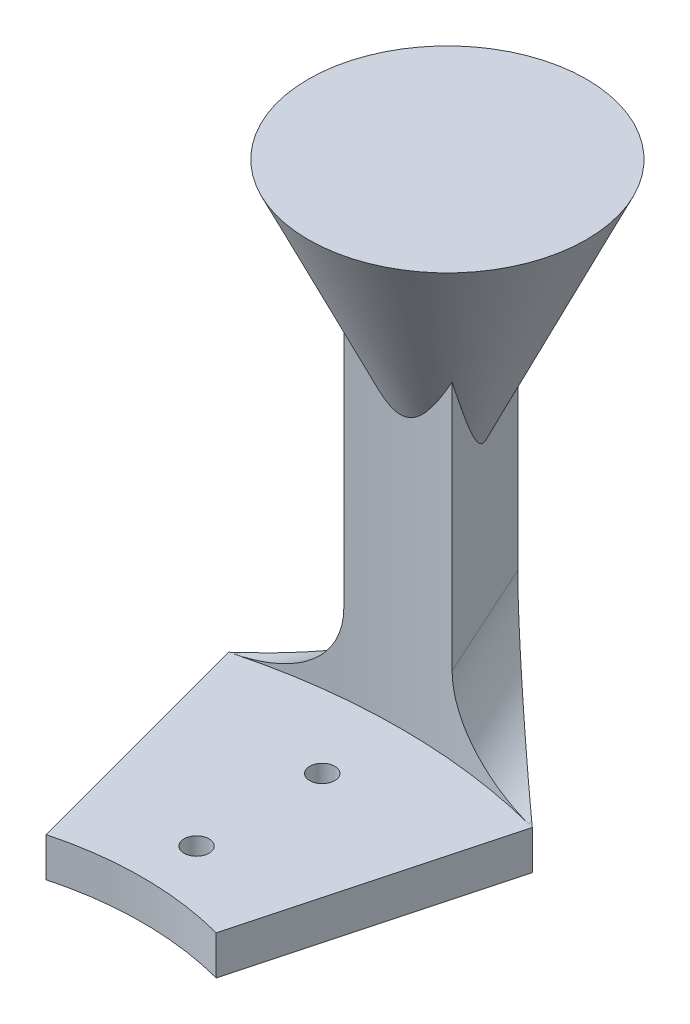
ISO-10303-21;
HEADER;
FILE_DESCRIPTION(('STEP AP214'),'2;1');
FILE_NAME('part.step','',(''),(''),'','','');
FILE_SCHEMA(('AUTOMOTIVE_DESIGN { 1 0 10303 214 1 1 1 1 }'));
ENDSEC;
DATA;
#1=APPLICATION_CONTEXT('core data for automotive mechanical design processes');
#2=APPLICATION_PROTOCOL_DEFINITION('international standard','automotive_design',2000,#1);
#3=PRODUCT_CONTEXT('',#1,'mechanical');
#4=PRODUCT('Part','Part','',(#3));
#5=PRODUCT_RELATED_PRODUCT_CATEGORY('part','',(#4));
#6=PRODUCT_DEFINITION_FORMATION('','',#4);
#7=PRODUCT_DEFINITION_CONTEXT('part definition',#1,'design');
#8=PRODUCT_DEFINITION('design','',#6,#7);
#9=PRODUCT_DEFINITION_SHAPE('','',#8);
#10=(LENGTH_UNIT() NAMED_UNIT(*) SI_UNIT(.MILLI.,.METRE.));
#11=(NAMED_UNIT(*) PLANE_ANGLE_UNIT() SI_UNIT($,.RADIAN.));
#12=(NAMED_UNIT(*) SI_UNIT($,.STERADIAN.) SOLID_ANGLE_UNIT());
#13=UNCERTAINTY_MEASURE_WITH_UNIT(LENGTH_MEASURE(1.E-05),#10,'distance_accuracy_value','');
#14=(GEOMETRIC_REPRESENTATION_CONTEXT(3) GLOBAL_UNCERTAINTY_ASSIGNED_CONTEXT((#13)) GLOBAL_UNIT_ASSIGNED_CONTEXT((#10,
#11,#12)) REPRESENTATION_CONTEXT('',''));
#15=CARTESIAN_POINT('',(0.,0.,0.));
#16=DIRECTION('',(0.,0.,1.));
#17=DIRECTION('',(1.,0.,0.));
#18=AXIS2_PLACEMENT_3D('',#15,#16,#17);
#19=CARTESIAN_POINT('',(0.,5.,0.));
#20=DIRECTION('',(0.,1.,0.));
#21=DIRECTION('',(0.,0.,1.));
#22=AXIS2_PLACEMENT_3D('',#19,#20,#21);
#23=PLANE('',#22);
#24=CARTESIAN_POINT('',(0.,5.,-48.92241394));
#25=DIRECTION('',(0.,1.,0.));
#26=DIRECTION('',(0.,0.,1.));
#27=AXIS2_PLACEMENT_3D('',#24,#25,#26);
#28=CIRCLE('',#27,1.6);
#29=CARTESIAN_POINT('',(0.,5.,-47.32241394));
#30=VERTEX_POINT('',#29);
#31=EDGE_CURVE('E257',#30,#30,#28,.T.);
#32=ORIENTED_EDGE('',*,*,#31,.F.);
#33=EDGE_LOOP('',(#32));
#34=FACE_BOUND('',#33,.T.);
#35=CARTESIAN_POINT('',(0.,5.,-65.));
#36=DIRECTION('',(0.,1.,0.));
#37=DIRECTION('',(0.,0.,1.));
#38=AXIS2_PLACEMENT_3D('',#35,#36,#37);
#39=CIRCLE('',#38,1.6);
#40=CARTESIAN_POINT('',(0.,5.,-63.4));
#41=VERTEX_POINT('',#40);
#42=EDGE_CURVE('E261',#41,#41,#39,.T.);
#43=ORIENTED_EDGE('',*,*,#42,.F.);
#44=EDGE_LOOP('',(#43));
#45=FACE_BOUND('',#44,.T.);
#46=CARTESIAN_POINT('',(0.,5.,0.));
#47=DIRECTION('',(0.,1.,0.));
#48=DIRECTION('',(0.,0.,1.));
#49=AXIS2_PLACEMENT_3D('',#46,#47,#48);
#50=CIRCLE('',#49,75.);
#51=CARTESIAN_POINT('',(18.842619407503,5.,-72.5944604902054));
#52=VERTEX_POINT('',#51);
#53=CARTESIAN_POINT('',(-18.842619407503,5.,-72.5944604902054));
#54=VERTEX_POINT('',#53);
#55=EDGE_CURVE('E148',#52,#54,#50,.T.);
#56=ORIENTED_EDGE('',*,*,#55,.T.);
#57=DIRECTION('',(0.411923166329655,0.,-0.91121858247127));
#58=VECTOR('',#57,1.);
#59=CARTESIAN_POINT('',(-9.11218582471269,5.,-94.1192316632966));
#60=LINE('',#59,#58);
#61=CARTESIAN_POINT('',(-18.563962791194,5.,-73.210879054793));
#62=VERTEX_POINT('',#61);
#63=EDGE_CURVE('E265',#54,#62,#60,.T.);
#64=ORIENTED_EDGE('',*,*,#63,.T.);
#65=DIRECTION('',(0.741671826170857,0.,-0.670762925529122));
#66=VECTOR('',#65,1.);
#67=CARTESIAN_POINT('',(-44.7737367514401,5.,-49.5069387962052));
#68=LINE('',#67,#66);
#69=CARTESIAN_POINT('',(-19.4114283826891,5.,-72.4444369716801));
#70=VERTEX_POINT('',#69);
#71=EDGE_CURVE('E274',#70,#62,#68,.T.);
#72=ORIENTED_EDGE('',*,*,#71,.F.);
#73=DIRECTION('',(-0.258819045102522,0.,-0.965925826289068));
#74=VECTOR('',#73,1.);
#75=CARTESIAN_POINT('',(0.,5.,0.));
#76=LINE('',#75,#74);
#77=CARTESIAN_POINT('',(-10.8703998943059,5.,-40.5688847041409));
#78=VERTEX_POINT('',#77);
#79=EDGE_CURVE('E278',#78,#70,#76,.T.);
#80=ORIENTED_EDGE('',*,*,#79,.F.);
#81=CARTESIAN_POINT('',(0.,5.,0.));
#82=DIRECTION('',(0.,1.,0.));
#83=DIRECTION('',(0.,0.,1.));
#84=AXIS2_PLACEMENT_3D('',#81,#82,#83);
#85=CIRCLE('',#84,42.);
#86=CARTESIAN_POINT('',(10.8703998943059,5.,-40.5688847041409));
#87=VERTEX_POINT('',#86);
#88=EDGE_CURVE('E281',#78,#87,#85,.F.);
#89=ORIENTED_EDGE('',*,*,#88,.T.);
#90=DIRECTION('',(0.258819045102521,0.,-0.965925826289068));
#91=VECTOR('',#90,1.);
#92=CARTESIAN_POINT('',(0.,5.,0.));
#93=LINE('',#92,#91);
#94=CARTESIAN_POINT('',(19.4114283826891,5.,-72.4444369716801));
#95=VERTEX_POINT('',#94);
#96=EDGE_CURVE('E283',#87,#95,#93,.T.);
#97=ORIENTED_EDGE('',*,*,#96,.T.);
#98=DIRECTION('',(-0.741671826170857,0.,-0.670762925529122));
#99=VECTOR('',#98,1.);
#100=CARTESIAN_POINT('',(44.7737367514401,5.,-49.5069387962052));
#101=LINE('',#100,#99);
#102=CARTESIAN_POINT('',(18.563962791194,5.,-73.210879054793));
#103=VERTEX_POINT('',#102);
#104=EDGE_CURVE('E279',#95,#103,#101,.T.);
#105=ORIENTED_EDGE('',*,*,#104,.T.);
#106=DIRECTION('',(0.411923166329654,0.,0.911218582471271));
#107=VECTOR('',#106,1.);
#108=CARTESIAN_POINT('',(16.0379123303948,5.,-78.7987757993482));
#109=LINE('',#108,#107);
#110=EDGE_CURVE('E162',#103,#52,#109,.T.);
#111=ORIENTED_EDGE('',*,*,#110,.T.);
#112=EDGE_LOOP('',(#56,#64,#72,#80,#89,#97,#105,#111));
#113=FACE_BOUND('',#112,.T.);
#114=ADVANCED_FACE('F61',(#34,#45,#113),#23,.T.);
#115=CARTESIAN_POINT('',(0.,0.,0.));
#116=DIRECTION('',(0.,1.,0.));
#117=DIRECTION('',(0.,0.,1.));
#118=AXIS2_PLACEMENT_3D('',#115,#116,#117);
#119=PLANE('',#118);
#120=DIRECTION('',(0.258819045102521,0.,-0.965925826289068));
#121=VECTOR('',#120,1.);
#122=CARTESIAN_POINT('',(0.,0.,0.));
#123=LINE('',#122,#121);
#124=CARTESIAN_POINT('',(10.8703998943059,0.,-40.5688847041409));
#125=VERTEX_POINT('',#124);
#126=CARTESIAN_POINT('',(19.4114283826891,0.,-72.4444369716801));
#127=VERTEX_POINT('',#126);
#128=EDGE_CURVE('E290',#125,#127,#123,.T.);
#129=ORIENTED_EDGE('',*,*,#128,.F.);
#130=CARTESIAN_POINT('',(0.,0.,0.));
#131=DIRECTION('',(0.,1.,0.));
#132=DIRECTION('',(0.,0.,1.));
#133=AXIS2_PLACEMENT_3D('',#130,#131,#132);
#134=CIRCLE('',#133,42.);
#135=CARTESIAN_POINT('',(-10.8703998943059,0.,-40.5688847041409));
#136=VERTEX_POINT('',#135);
#137=EDGE_CURVE('E301',#136,#125,#134,.F.);
#138=ORIENTED_EDGE('',*,*,#137,.F.);
#139=DIRECTION('',(-0.258819045102522,0.,-0.965925826289068));
#140=VECTOR('',#139,1.);
#141=CARTESIAN_POINT('',(0.,0.,0.));
#142=LINE('',#141,#140);
#143=CARTESIAN_POINT('',(-19.4114283826891,0.,-72.4444369716801));
#144=VERTEX_POINT('',#143);
#145=EDGE_CURVE('E298',#136,#144,#142,.T.);
#146=ORIENTED_EDGE('',*,*,#145,.T.);
#147=DIRECTION('',(0.741671826170857,0.,-0.670762925529122));
#148=VECTOR('',#147,1.);
#149=CARTESIAN_POINT('',(-44.7737367514401,0.,-49.5069387962052));
#150=LINE('',#149,#148);
#151=CARTESIAN_POINT('',(0.,0.,-90.));
#152=VERTEX_POINT('',#151);
#153=EDGE_CURVE('E295',#144,#152,#150,.T.);
#154=ORIENTED_EDGE('',*,*,#153,.T.);
#155=DIRECTION('',(-0.741671826170857,0.,-0.670762925529122));
#156=VECTOR('',#155,1.);
#157=CARTESIAN_POINT('',(44.7737367514401,0.,-49.5069387962052));
#158=LINE('',#157,#156);
#159=EDGE_CURVE('E293',#127,#152,#158,.T.);
#160=ORIENTED_EDGE('',*,*,#159,.F.);
#161=EDGE_LOOP('',(#129,#138,#146,#154,#160));
#162=FACE_BOUND('',#161,.T.);
#163=CARTESIAN_POINT('',(0.,0.,-48.92241394));
#164=DIRECTION('',(0.,1.,0.));
#165=DIRECTION('',(0.,0.,1.));
#166=AXIS2_PLACEMENT_3D('',#163,#164,#165);
#167=CIRCLE('',#166,1.6);
#168=CARTESIAN_POINT('',(0.,0.,-47.32241394));
#169=VERTEX_POINT('',#168);
#170=EDGE_CURVE('E303',#169,#169,#167,.T.);
#171=ORIENTED_EDGE('',*,*,#170,.T.);
#172=EDGE_LOOP('',(#171));
#173=FACE_BOUND('',#172,.T.);
#174=CARTESIAN_POINT('',(0.,0.,-65.));
#175=DIRECTION('',(0.,1.,0.));
#176=DIRECTION('',(0.,0.,1.));
#177=AXIS2_PLACEMENT_3D('',#174,#175,#176);
#178=CIRCLE('',#177,1.6);
#179=CARTESIAN_POINT('',(0.,0.,-63.4));
#180=VERTEX_POINT('',#179);
#181=EDGE_CURVE('E320',#180,#180,#178,.T.);
#182=ORIENTED_EDGE('',*,*,#181,.T.);
#183=EDGE_LOOP('',(#182));
#184=FACE_BOUND('',#183,.T.);
#185=ADVANCED_FACE('F227',(#162,#173,#184),#119,.F.);
#186=CARTESIAN_POINT('',(0.,5.,0.));
#187=DIRECTION('',(-0.965925826289068,0.,-0.258819045102521));
#188=DIRECTION('',(-0.258819045102521,0.,0.965925826289068));
#189=AXIS2_PLACEMENT_3D('',#186,#187,#188);
#190=PLANE('',#189);
#191=ORIENTED_EDGE('',*,*,#128,.T.);
#192=DIRECTION('',(0.,-1.,0.));
#193=VECTOR('',#192,1.);
#194=CARTESIAN_POINT('',(19.4114283826891,5.,-72.4444369716801));
#195=LINE('',#194,#193);
#196=EDGE_CURVE('E163',#95,#127,#195,.T.);
#197=ORIENTED_EDGE('',*,*,#196,.F.);
#198=ORIENTED_EDGE('',*,*,#96,.F.);
#199=DIRECTION('',(0.,-1.,0.));
#200=VECTOR('',#199,1.);
#201=CARTESIAN_POINT('',(10.8703998943059,5.,-40.5688847041409));
#202=LINE('',#201,#200);
#203=EDGE_CURVE('E289',#87,#125,#202,.T.);
#204=ORIENTED_EDGE('',*,*,#203,.T.);
#205=EDGE_LOOP('',(#191,#197,#198,#204));
#206=FACE_BOUND('',#205,.T.);
#207=ADVANCED_FACE('F223',(#206),#190,.F.);
#208=CARTESIAN_POINT('',(44.7737367514401,5.,-49.5069387962052));
#209=DIRECTION('',(-0.670762925529122,0.,0.741671826170857));
#210=DIRECTION('',(0.741671826170857,0.,0.670762925529122));
#211=AXIS2_PLACEMENT_3D('',#208,#209,#210);
#212=PLANE('',#211);
#213=ORIENTED_EDGE('',*,*,#159,.T.);
#214=DIRECTION('',(0.,-1.,0.));
#215=VECTOR('',#214,1.);
#216=CARTESIAN_POINT('',(0.,5.,-90.));
#217=LINE('',#216,#215);
#218=CARTESIAN_POINT('',(0.,15.,-90.));
#219=VERTEX_POINT('',#218);
#220=EDGE_CURVE('E82',#219,#152,#217,.T.);
#221=ORIENTED_EDGE('',*,*,#220,.F.);
#222=CARTESIAN_POINT('',(18.563962791194,15.,-73.210879054793));
#223=DIRECTION('',(-0.670762925529122,0.,0.741671826170857));
#224=DIRECTION('',(-0.741671826170856,0.,-0.670762925529122));
#225=AXIS2_PLACEMENT_3D('',#222,#223,#224);
#226=ELLIPSE('',#225,25.0298880665819,10.);
#227=EDGE_CURVE('E216',#219,#103,#226,.T.);
#228=ORIENTED_EDGE('',*,*,#227,.T.);
#229=ORIENTED_EDGE('',*,*,#104,.F.);
#230=ORIENTED_EDGE('',*,*,#196,.T.);
#231=EDGE_LOOP('',(#213,#221,#228,#229,#230));
#232=FACE_BOUND('',#231,.T.);
#233=ADVANCED_FACE('F226',(#232),#212,.F.);
#234=CARTESIAN_POINT('',(-44.7737367514401,5.,-49.5069387962052));
#235=DIRECTION('',(-0.670762925529122,0.,-0.741671826170857));
#236=DIRECTION('',(-0.741671826170857,0.,0.670762925529122));
#237=AXIS2_PLACEMENT_3D('',#234,#235,#236);
#238=PLANE('',#237);
#239=ORIENTED_EDGE('',*,*,#153,.F.);
#240=DIRECTION('',(0.,-1.,0.));
#241=VECTOR('',#240,1.);
#242=CARTESIAN_POINT('',(-19.4114283826891,5.,-72.4444369716801));
#243=LINE('',#242,#241);
#244=EDGE_CURVE('E275',#70,#144,#243,.T.);
#245=ORIENTED_EDGE('',*,*,#244,.F.);
#246=ORIENTED_EDGE('',*,*,#71,.T.);
#247=CARTESIAN_POINT('',(-18.563962791194,15.,-73.2108790547931));
#248=DIRECTION('',(-0.670762925529122,0.,-0.741671826170857));
#249=DIRECTION('',(-0.741671826170857,0.,0.670762925529122));
#250=AXIS2_PLACEMENT_3D('',#247,#248,#249);
#251=ELLIPSE('',#250,25.029888066582,10.);
#252=EDGE_CURVE('E75',#62,#219,#251,.F.);
#253=ORIENTED_EDGE('',*,*,#252,.T.);
#254=ORIENTED_EDGE('',*,*,#220,.T.);
#255=EDGE_LOOP('',(#239,#245,#246,#253,#254));
#256=FACE_BOUND('',#255,.T.);
#257=ADVANCED_FACE('F231',(#256),#238,.T.);
#258=CARTESIAN_POINT('',(0.,5.,0.));
#259=DIRECTION('',(-0.965925826289068,0.,0.258819045102522));
#260=DIRECTION('',(0.258819045102522,0.,0.965925826289068));
#261=AXIS2_PLACEMENT_3D('',#258,#259,#260);
#262=PLANE('',#261);
#263=ORIENTED_EDGE('',*,*,#145,.F.);
#264=DIRECTION('',(0.,-1.,0.));
#265=VECTOR('',#264,1.);
#266=CARTESIAN_POINT('',(-10.8703998943059,5.,-40.5688847041409));
#267=LINE('',#266,#265);
#268=EDGE_CURVE('E308',#78,#136,#267,.T.);
#269=ORIENTED_EDGE('',*,*,#268,.F.);
#270=ORIENTED_EDGE('',*,*,#79,.T.);
#271=ORIENTED_EDGE('',*,*,#244,.T.);
#272=EDGE_LOOP('',(#263,#269,#270,#271));
#273=FACE_BOUND('',#272,.T.);
#274=ADVANCED_FACE('F234',(#273),#262,.T.);
#275=CARTESIAN_POINT('',(0.,5.,0.));
#276=DIRECTION('',(0.,-1.,0.));
#277=DIRECTION('',(0.,0.,-1.));
#278=AXIS2_PLACEMENT_3D('',#275,#276,#277);
#279=CYLINDRICAL_SURFACE('',#278,42.);
#280=ORIENTED_EDGE('',*,*,#137,.T.);
#281=ORIENTED_EDGE('',*,*,#203,.F.);
#282=ORIENTED_EDGE('',*,*,#88,.F.);
#283=ORIENTED_EDGE('',*,*,#268,.T.);
#284=EDGE_LOOP('',(#280,#281,#282,#283));
#285=FACE_BOUND('',#284,.T.);
#286=ADVANCED_FACE('F238',(#285),#279,.F.);
#287=CARTESIAN_POINT('',(0.,5.,-48.92241394));
#288=DIRECTION('',(0.,-1.,0.));
#289=DIRECTION('',(0.,0.,-1.));
#290=AXIS2_PLACEMENT_3D('',#287,#288,#289);
#291=CYLINDRICAL_SURFACE('',#290,1.6);
#292=ORIENTED_EDGE('',*,*,#31,.T.);
#293=EDGE_LOOP('',(#292));
#294=FACE_BOUND('',#293,.T.);
#295=ORIENTED_EDGE('',*,*,#170,.F.);
#296=EDGE_LOOP('',(#295));
#297=FACE_BOUND('',#296,.T.);
#298=ADVANCED_FACE('F242',(#294,#297),#291,.F.);
#299=CARTESIAN_POINT('',(0.,5.,-65.));
#300=DIRECTION('',(0.,-1.,0.));
#301=DIRECTION('',(0.,0.,-1.));
#302=AXIS2_PLACEMENT_3D('',#299,#300,#301);
#303=CYLINDRICAL_SURFACE('',#302,1.6);
#304=ORIENTED_EDGE('',*,*,#42,.T.);
#305=EDGE_LOOP('',(#304));
#306=FACE_BOUND('',#305,.T.);
#307=ORIENTED_EDGE('',*,*,#181,.F.);
#308=EDGE_LOOP('',(#307));
#309=FACE_BOUND('',#308,.T.);
#310=ADVANCED_FACE('F205',(#306,#309),#303,.F.);
#311=CARTESIAN_POINT('',(0.,65.,0.));
#312=DIRECTION('',(0.,-1.,0.));
#313=DIRECTION('',(0.,0.,-1.));
#314=AXIS2_PLACEMENT_3D('',#311,#312,#313);
#315=CYLINDRICAL_SURFACE('',#314,75.);
#316=CARTESIAN_POINT('',(-6.92592650568208,46.9784191036056,-74.6795255879273));
#317=CARTESIAN_POINT('',(-6.77406405661688,46.7175794760452,-74.6936061485588));
#318=CARTESIAN_POINT('',(-6.62069759319416,46.4575826770351,-74.7073657864836));
#319=CARTESIAN_POINT('',(-6.31019490046,45.9397227244774,-74.7342349122299));
#320=CARTESIAN_POINT('',(-6.15305766267658,45.6818601670877,-74.7473442231841));
#321=CARTESIAN_POINT('',(-5.83341855641709,45.1673864216268,-74.7729700768331));
#322=CARTESIAN_POINT('',(-5.67089107752603,44.910790906135,-74.7854827862178));
#323=CARTESIAN_POINT('',(-5.34033170628858,44.4011630063604,-74.8098145092442));
#324=CARTESIAN_POINT('',(-5.17230043768173,44.148130222932,-74.8216336010721));
#325=CARTESIAN_POINT('',(-4.85514967917784,43.6844506534751,-74.8428274984415));
#326=CARTESIAN_POINT('',(-4.70698860353137,43.4731546299114,-74.8523025098454));
#327=CARTESIAN_POINT('',(-4.404570508605,43.0549488220209,-74.8707067124568));
#328=CARTESIAN_POINT('',(-4.25031399711989,42.8480386745154,-74.8796359489743));
#329=CARTESIAN_POINT('',(-3.93436373125033,42.440296497884,-74.896901100365));
#330=CARTESIAN_POINT('',(-3.7726785404961,42.2394578916632,-74.9052376715346));
#331=CARTESIAN_POINT('',(-3.43970770414807,41.8458915584644,-74.9212669416896));
#332=CARTESIAN_POINT('',(-3.26842584230979,41.6531606865366,-74.928959891499));
#333=CARTESIAN_POINT('',(-2.99460049532053,41.3649245429902,-74.940253668287));
#334=CARTESIAN_POINT('',(-2.89644460144339,41.2652648780889,-74.9441169601807));
#335=CARTESIAN_POINT('',(-2.69589418671269,41.0703117376545,-74.9515992790725));
#336=CARTESIAN_POINT('',(-2.59350052331406,40.9750173870012,-74.9552183550982));
#337=CARTESIAN_POINT('',(-2.38381612308755,40.7899387133092,-74.9621799647809));
#338=CARTESIAN_POINT('',(-2.27652582195973,40.700153901695,-74.9655225229682));
#339=CARTESIAN_POINT('',(-2.05638186576225,40.5277232919475,-74.9718841205561));
#340=CARTESIAN_POINT('',(-1.94353017891742,40.4450749962341,-74.9749032732293));
#341=CARTESIAN_POINT('',(-1.6668494253348,40.2589175614468,-74.9816477091204));
#342=CARTESIAN_POINT('',(-1.50010918869613,40.1596128623474,-74.985197894118));
#343=CARTESIAN_POINT('',(-1.15373977095655,39.9867711293613,-74.9913238905226));
#344=CARTESIAN_POINT('',(-0.974142300031,39.9131731645604,-74.9939020071266));
#345=CARTESIAN_POINT('',(-0.64396399685859,39.8135410746033,-74.9973755559833));
#346=CARTESIAN_POINT('',(-0.495494422804926,39.7806670920205,-74.9985141582057));
#347=CARTESIAN_POINT('',(-0.19512019955301,39.7407358748786,-74.9998960054379));
#348=CARTESIAN_POINT('',(-0.0432188782782721,39.7336546252263,-75.0001400833226));
#349=CARTESIAN_POINT('',(0.259460475097765,39.7462744460827,-74.9997040485328));
#350=CARTESIAN_POINT('',(0.410238255153762,39.7659813543322,-74.9990237344125));
#351=CARTESIAN_POINT('',(0.706550762010795,39.8295170989767,-74.996818816199));
#352=CARTESIAN_POINT('',(0.852080314005749,39.8733690852226,-74.9952934018306));
#353=CARTESIAN_POINT('',(1.20861486278241,40.0081540802552,-74.9905689130136));
#354=CARTESIAN_POINT('',(1.41479829337812,40.1117018671578,-74.9869125511955));
#355=CARTESIAN_POINT('',(1.71052882341606,40.2889361038749,-74.9805568329392));
#356=CARTESIAN_POINT('',(1.80704792553713,40.3518309324001,-74.9782870317001));
#357=CARTESIAN_POINT('',(1.99594221951859,40.4835689937497,-74.9734961053367));
#358=CARTESIAN_POINT('',(2.08831837936048,40.5524108259654,-74.9709750393676));
#359=CARTESIAN_POINT('',(2.30842356389853,40.7256663033825,-74.9645784913267));
#360=CARTESIAN_POINT('',(2.43416124019411,40.832586427052,-74.9605888411295));
#361=CARTESIAN_POINT('',(2.67908115956656,41.0537219444454,-74.9522350005142));
#362=CARTESIAN_POINT('',(2.79825994071449,41.1679411233232,-74.9478706153557));
#363=CARTESIAN_POINT('',(3.03124721524852,41.4021130320875,-74.9388094011034));
#364=CARTESIAN_POINT('',(3.14504519991985,41.5220761294661,-74.9341119629103));
#365=CARTESIAN_POINT('',(3.36792035782892,41.7663166609366,-74.9244255971887));
#366=CARTESIAN_POINT('',(3.47699665175751,41.8905948909256,-74.9194366157699));
#367=CARTESIAN_POINT('',(3.6919308546663,42.143501690902,-74.9091537102001));
#368=CARTESIAN_POINT('',(3.79775823274556,42.2721560291437,-74.903857767433));
#369=CARTESIAN_POINT('',(4.00592226175399,42.5322540906588,-74.8930132637763));
#370=CARTESIAN_POINT('',(4.10825863291842,42.663698036125,-74.8874646827234));
#371=CARTESIAN_POINT('',(4.41053641991247,43.0611042091097,-74.8704745825462));
#372=CARTESIAN_POINT('',(4.60600662946885,43.3304525944155,-74.8586760661831));
#373=CARTESIAN_POINT('',(4.990012647148,43.8783996751908,-74.834063961503));
#374=CARTESIAN_POINT('',(5.17844777973211,44.1570677520128,-74.8212405850103));
#375=CARTESIAN_POINT('',(5.54819449522563,44.7191831336796,-74.794731642198));
#376=CARTESIAN_POINT('',(5.72950341299696,45.0026321709732,-74.781045758198));
#377=CARTESIAN_POINT('',(6.08249169143723,45.56678605286,-74.7531536270174));
#378=CARTESIAN_POINT('',(6.25429506828271,45.8474145515759,-74.7389653973723));
#379=CARTESIAN_POINT('',(6.59329591225171,46.4111732353895,-74.7098198310221));
#380=CARTESIAN_POINT('',(6.76049609288329,46.6943018108261,-74.6948629629997));
#381=CARTESIAN_POINT('',(6.92592650568206,46.9784191036056,-74.6795255879273));
#382=B_SPLINE_CURVE_WITH_KNOTS('',3,(#316,#317,#318,#319,#320,#321,#322,#323,#324,#325,#326,
#327,#328,#329,#330,#331,#332,#333,#334,#335,#336,#337,#338,#339,#340,#341,#342,#343,#344,#345,
#346,#347,#348,#349,#350,#351,#352,#353,#354,#355,#356,#357,#358,#359,#360,#361,#362,#363,#364,
#365,#366,#367,#368,#369,#370,#371,#372,#373,#374,#375,#376,#377,#378,#379,#380,#381),
.UNSPECIFIED.,.F.,.F.,(4,2,2,2,2,2,2,2,2,2,2,2,2,2,2,2,2,2,2,2,2,2,2,2,2,2,2,2,2,2,2,2,4),(0.,
0.906480682714559,1.8132065616114,2.72513570505702,3.63696185555962,4.41159599566859,
5.18616573852733,5.95986394106417,6.73325920928838,7.15295773530827,7.57257175228571,
7.99214850476212,8.41157781693844,8.99234339576436,9.57172293255078,10.0259618272202,
10.4797776809526,10.9336924471998,11.3880431782208,12.0760792624127,12.4216396217017,
12.7671188170652,13.2620326857107,13.7572053235888,14.2533081497021,14.7495029698521,
15.2494455368176,15.7494280748544,16.7481756129511,17.7579755469938,18.7681496114083,
19.756148849979,20.7435526363719),.UNSPECIFIED.);
#383=CARTESIAN_POINT('',(-6.92572650568208,46.9780754822792,-74.6795441360517));
#384=VERTEX_POINT('',#383);
#385=CARTESIAN_POINT('',(6.92572650568207,46.9780754822792,-74.6795441360517));
#386=VERTEX_POINT('',#385);
#387=EDGE_CURVE('E152',#384,#386,#382,.T.);
#388=ORIENTED_EDGE('',*,*,#387,.F.);
#389=DIRECTION('',(0.,-1.,0.));
#390=VECTOR('',#389,1.);
#391=CARTESIAN_POINT('',(-6.92572650568208,65.,-74.6795441360517));
#392=LINE('',#391,#390);
#393=CARTESIAN_POINT('',(-6.92572650568208,15.,-74.6795441360517));
#394=VERTEX_POINT('',#393);
#395=EDGE_CURVE('E139',#384,#394,#392,.T.);
#396=ORIENTED_EDGE('',*,*,#395,.T.);
#397=CARTESIAN_POINT('',(-6.92572650568208,15.,-74.6795441360517));
#398=CARTESIAN_POINT('',(-6.92568032506884,14.7472924298984,-74.6795382141566));
#399=CARTESIAN_POINT('',(-6.93669686043953,14.4945986433396,-74.6785264629675));
#400=CARTESIAN_POINT('',(-6.98051620298935,13.9911852431371,-74.6744486687679));
#401=CARTESIAN_POINT('',(-7.01331355645742,13.7404651511964,-74.6713831400023));
#402=CARTESIAN_POINT('',(-7.10020278251981,13.2436915629054,-74.6631696513348));
#403=CARTESIAN_POINT('',(-7.15421943515563,12.9976247659642,-74.6580290455841));
#404=CARTESIAN_POINT('',(-7.28291465226355,12.511011930936,-74.6455849743));
#405=CARTESIAN_POINT('',(-7.35759373381096,12.2704660311721,-74.6382814546395));
#406=CARTESIAN_POINT('',(-7.52673090951067,11.7966778596928,-74.6214146455933));
#407=CARTESIAN_POINT('',(-7.62117771725359,11.5634315072707,-74.6118526452915));
#408=CARTESIAN_POINT('',(-7.82885966292182,11.1055665645112,-74.5903468859764));
#409=CARTESIAN_POINT('',(-7.94209606281687,10.88094855493,-74.5784029669748));
#410=CARTESIAN_POINT('',(-8.18623097515594,10.4415708703358,-74.5519999257622));
#411=CARTESIAN_POINT('',(-8.31713682407723,10.2268153401989,-74.5375397580622));
#412=CARTESIAN_POINT('',(-8.59528652274416,9.80837583569237,-74.5059771641418));
#413=CARTESIAN_POINT('',(-8.74253074339875,9.60469211282809,-74.4888746779327));
#414=CARTESIAN_POINT('',(-9.05806308702468,9.20156220616975,-74.4511766708717));
#415=CARTESIAN_POINT('',(-9.2269499717431,9.00259533976443,-74.4304704802856));
#416=CARTESIAN_POINT('',(-9.57937037153128,8.61836524450275,-74.3859342442933));
#417=CARTESIAN_POINT('',(-9.76290877314989,8.43310662762869,-74.3621031549589));
#418=CARTESIAN_POINT('',(-10.1429929498482,8.07696135643788,-74.3112134711763));
#419=CARTESIAN_POINT('',(-10.3395384710238,7.90607442172817,-74.2841549397208));
#420=CARTESIAN_POINT('',(-10.7440936477911,7.57905021416155,-74.2267216204934));
#421=CARTESIAN_POINT('',(-10.9521046695331,7.4229147050251,-74.1963464371072));
#422=CARTESIAN_POINT('',(-11.4032537653297,7.10805651977909,-74.1284275906096));
#423=CARTESIAN_POINT('',(-11.6476377586527,6.95120926737071,-74.0904609921086));
#424=CARTESIAN_POINT('',(-12.1468354968987,6.65634573930851,-74.0102582583296));
#425=CARTESIAN_POINT('',(-12.4016502400152,6.5183312714019,-73.9680217138586));
#426=CARTESIAN_POINT('',(-12.9199667165241,6.26097569185838,-73.8792498696298));
#427=CARTESIAN_POINT('',(-13.183472586743,6.14164363266513,-73.8327125031966));
#428=CARTESIAN_POINT('',(-13.7173687917278,5.92145871306034,-73.7353895151228));
#429=CARTESIAN_POINT('',(-13.9877614509162,5.82061218858635,-73.6846024455464));
#430=CARTESIAN_POINT('',(-14.8969964036165,5.51503820955293,-73.5084869727426));
#431=CARTESIAN_POINT('',(-15.5478664307899,5.35040190092498,-73.3738062546426));
#432=CARTESIAN_POINT('',(-16.8606637505038,5.11420424183961,-73.0833109184127));
#433=CARTESIAN_POINT('',(-17.5225819590962,5.04256990661427,-72.9275129785346));
#434=CARTESIAN_POINT('',(-18.2933183626637,5.00940619022501,-72.7349124784875));
#435=CARTESIAN_POINT('',(-18.4033087623313,5.00587008242432,-72.7071603298384));
#436=CARTESIAN_POINT('',(-18.6230878145158,5.00116858742251,-72.6511760554211));
#437=CARTESIAN_POINT('',(-18.7328765553474,5.00000056723824,-72.6229444979596));
#438=CARTESIAN_POINT('',(-18.842619407503,5.,-72.5944604902054));
#439=B_SPLINE_CURVE_WITH_KNOTS('',3,(#397,#398,#399,#400,#401,#402,#403,#404,#405,#406,#407,
#408,#409,#410,#411,#412,#413,#414,#415,#416,#417,#418,#419,#420,#421,#422,#423,#424,#425,#426,
#427,#428,#429,#430,#431,#432,#433,#434,#435,#436,#437,#438),.UNSPECIFIED.,.F.,.F.,(4,2,2,2,2,2,
2,2,2,2,2,2,2,2,2,2,2,2,2,2,4),(0.,0.757859443398614,1.51552919746339,2.27053699174413,
3.02556368173179,3.7801604584796,4.53480793691466,5.28976971961427,6.04474864474387,
6.82933086198683,7.61417585386526,8.39900552978554,9.18392892363525,10.0616261500137,
10.9394075668242,11.8176129994487,12.6961188774092,14.7423176373168,16.7869096378433,
17.1273812076792,17.4674740125522),.UNSPECIFIED.);
#440=EDGE_CURVE('E12',#394,#54,#439,.T.);
#441=ORIENTED_EDGE('',*,*,#440,.T.);
#442=ORIENTED_EDGE('',*,*,#55,.F.);
#443=CARTESIAN_POINT('',(18.842619407503,5.,-72.5944604902054));
#444=CARTESIAN_POINT('',(18.4331153241129,5.00001434905719,-72.7007888970609));
#445=CARTESIAN_POINT('',(18.0225515031127,5.01627590841122,-72.8036199057631));
#446=CARTESIAN_POINT('',(17.2017933903396,5.08281557474575,-73.0018858992078));
#447=CARTESIAN_POINT('',(16.7916004663726,5.13314228810806,-73.0973100982687));
#448=CARTESIAN_POINT('',(15.9729038687102,5.26973627365974,-73.2805818994243));
#449=CARTESIAN_POINT('',(15.5644236432356,5.35620949351593,-73.3683825471888));
#450=CARTESIAN_POINT('',(14.7555830719087,5.56657300677606,-73.535317859339));
#451=CARTESIAN_POINT('',(14.3552177025071,5.69043934677924,-73.6144580273933));
#452=CARTESIAN_POINT('',(13.6589939844454,5.94339513468591,-73.7463665524832));
#453=CARTESIAN_POINT('',(13.3605702137953,6.06450528655161,-73.800976781237));
#454=CARTESIAN_POINT('',(12.7731635170065,6.32992703468973,-73.9049065182201));
#455=CARTESIAN_POINT('',(12.4841819230498,6.47424188801562,-73.9542252821073));
#456=CARTESIAN_POINT('',(11.9188242139971,6.78597021140439,-74.0474412347477));
#457=CARTESIAN_POINT('',(11.642422712429,6.95333414367265,-74.0913496780199));
#458=CARTESIAN_POINT('',(11.1043143433729,7.31134543948683,-74.1739057034227));
#459=CARTESIAN_POINT('',(10.842605370556,7.50198945467751,-74.212554040423));
#460=CARTESIAN_POINT('',(10.3344263222263,7.90805971756506,-74.2850329241079));
#461=CARTESIAN_POINT('',(10.0881167640405,8.12369587877345,-74.318816381166));
#462=CARTESIAN_POINT('',(9.6165917291536,8.57740895646404,-74.3812995004686));
#463=CARTESIAN_POINT('',(9.39136556020665,8.81547437389044,-74.4100017462565));
#464=CARTESIAN_POINT('',(8.9649307510495,9.31293308411647,-74.4625826531674));
#465=CARTESIAN_POINT('',(8.7637321615146,9.57233522592738,-74.4864592986251));
#466=CARTESIAN_POINT('',(8.38858954183619,10.1104882995653,-74.5296400336322));
#467=CARTESIAN_POINT('',(8.21463935732281,10.3892348416503,-74.5489451562187));
#468=CARTESIAN_POINT('',(7.91889342115032,10.9238092179873,-74.5808962791384));
#469=CARTESIAN_POINT('',(7.79321071493776,11.1774598928451,-74.5940943586884));
#470=CARTESIAN_POINT('',(7.56584327631322,11.6954138195111,-74.6174985573286));
#471=CARTESIAN_POINT('',(7.464154418968,11.9597152311236,-74.6277051907702));
#472=CARTESIAN_POINT('',(7.28633672311227,12.4962997258933,-74.6452763264548));
#473=CARTESIAN_POINT('',(7.21015831059241,12.7685661972848,-74.6526463452558));
#474=CARTESIAN_POINT('',(7.0842076856179,13.3190681406522,-74.6647039553573));
#475=CARTESIAN_POINT('',(7.03441947365556,13.597299889365,-74.6693931720754));
#476=CARTESIAN_POINT('',(6.97405221260544,14.0634858884657,-74.6750505650241));
#477=CARTESIAN_POINT('',(6.9559273077138,14.2504869000465,-74.6767388710542));
#478=CARTESIAN_POINT('',(6.93176902425975,14.6249832254693,-74.6789837877022));
#479=CARTESIAN_POINT('',(6.92571692745555,14.8124773220947,-74.6795421502564));
#480=CARTESIAN_POINT('',(6.92572650568207,15.,-74.6795441360517));
#481=B_SPLINE_CURVE_WITH_KNOTS('',3,(#443,#444,#445,#446,#447,#448,#449,#450,#451,#452,#453,
#454,#455,#456,#457,#458,#459,#460,#461,#462,#463,#464,#465,#466,#467,#468,#469,#470,#471,#472,
#473,#474,#475,#476,#477,#478,#479,#480),.UNSPECIFIED.,.F.,.F.,(4,2,2,2,2,2,2,2,2,2,2,2,2,2,2,2,
2,2,4),(0.,1.26914588619441,2.54010650051574,3.81840940572978,5.09589518306114,6.07496188885886,
7.05416613836836,8.03129777390979,9.0082890345775,9.99417927901353,10.9795667984479,
11.9653650698416,12.9509403651657,13.799933379836,14.6487803322683,15.4959680307899,
16.3426415181846,16.9059293396828,17.4683431326927),.UNSPECIFIED.);
#482=CARTESIAN_POINT('',(6.92572650568207,15.,-74.6795441360517));
#483=VERTEX_POINT('',#482);
#484=EDGE_CURVE('E210',#52,#483,#481,.T.);
#485=ORIENTED_EDGE('',*,*,#484,.T.);
#486=DIRECTION('',(0.,-1.,0.));
#487=VECTOR('',#486,1.);
#488=CARTESIAN_POINT('',(6.92572650568207,65.,-74.6795441360517));
#489=LINE('',#488,#487);
#490=EDGE_CURVE('E155',#386,#483,#489,.T.);
#491=ORIENTED_EDGE('',*,*,#490,.F.);
#492=EDGE_LOOP('',(#388,#396,#441,#442,#485,#491));
#493=FACE_BOUND('',#492,.T.);
#494=ADVANCED_FACE('F153',(#493),#315,.F.);
#495=CARTESIAN_POINT('',(33.7816839338987,65.,-15.2712625463143));
#496=DIRECTION('',(0.911218582471271,0.,-0.411923166329654));
#497=DIRECTION('',(-0.411923166329654,0.,-0.911218582471271));
#498=AXIS2_PLACEMENT_3D('',#495,#496,#497);
#499=PLANE('',#498);
#500=ORIENTED_EDGE('',*,*,#490,.T.);
#501=DIRECTION('',(0.411923166329654,0.,0.911218582471271));
#502=VECTOR('',#501,1.);
#503=CARTESIAN_POINT('',(0.,15.,-90.));
#504=LINE('',#503,#502);
#505=EDGE_CURVE('E166',#483,#219,#504,.F.);
#506=ORIENTED_EDGE('',*,*,#505,.T.);
#507=DIRECTION('',(0.,-1.,0.));
#508=VECTOR('',#507,1.);
#509=CARTESIAN_POINT('',(0.,65.,-90.));
#510=LINE('',#509,#508);
#511=CARTESIAN_POINT('',(0.,46.1712292379262,-90.));
#512=VERTEX_POINT('',#511);
#513=EDGE_CURVE('E147',#512,#219,#510,.T.);
#514=ORIENTED_EDGE('',*,*,#513,.F.);
#515=CARTESIAN_POINT('',(6.92581691717592,46.9785078172804,-74.6793441360517));
#516=CARTESIAN_POINT('',(6.84251084440979,46.5802141840139,-74.8636261763496));
#517=CARTESIAN_POINT('',(6.75886009316495,46.1823415360378,-75.0486706827102));
#518=CARTESIAN_POINT('',(6.59055990625387,45.3872814650529,-75.4209688933528));
#519=CARTESIAN_POINT('',(6.50590945895398,44.9900953047796,-75.6082248354778));
#520=CARTESIAN_POINT('',(6.3330861996234,44.1859781135778,-75.9905285713625));
#521=CARTESIAN_POINT('',(6.2448813247668,43.7790876338413,-76.1856472915598));
#522=CARTESIAN_POINT('',(6.06703511403933,42.9677248323819,-76.5790623390332));
#523=CARTESIAN_POINT('',(5.97739544872341,42.5632503582781,-76.7773549708611));
#524=CARTESIAN_POINT('',(5.82183757964923,41.8715091394195,-77.1214657967052));
#525=CARTESIAN_POINT('',(5.75641445157325,41.5835869441363,-77.266188829783));
#526=CARTESIAN_POINT('',(5.62426518870303,41.0095123312245,-77.5585172876849));
#527=CARTESIAN_POINT('',(5.55753907318662,40.7233598874947,-77.7061226698644));
#528=CARTESIAN_POINT('',(5.42215621756229,40.1522233574402,-78.0056041845656));
#529=CARTESIAN_POINT('',(5.35349280942143,39.8672485555809,-78.1574950674971));
#530=CARTESIAN_POINT('',(5.21399934937592,39.3005541254448,-78.4660696836307));
#531=CARTESIAN_POINT('',(5.14316998644286,39.0188335005302,-78.622751892753));
#532=CARTESIAN_POINT('',(4.99996013297957,38.465230622388,-78.9395475729559));
#533=CARTESIAN_POINT('',(4.92763590000375,38.1932634116626,-79.0995365962434));
#534=CARTESIAN_POINT('',(4.81612794748728,37.7899677950739,-79.3462042438333));
#535=CARTESIAN_POINT('',(4.77842838426681,37.6562224989223,-79.4295997538835));
#536=CARTESIAN_POINT('',(4.70182699734917,37.3907809261237,-79.5990503041508));
#537=CARTESIAN_POINT('',(4.66292524704078,37.2590845251346,-79.6851051820241));
#538=CARTESIAN_POINT('',(4.58393718919633,36.9992282212897,-79.8598353064366));
#539=CARTESIAN_POINT('',(4.54386120296678,36.8710498963059,-79.9484877211299));
#540=CARTESIAN_POINT('',(4.46191192198093,36.6180431618785,-80.1297683913088));
#541=CARTESIAN_POINT('',(4.42003812416954,36.4932157061493,-80.2223977596067));
#542=CARTESIAN_POINT('',(4.33415288291401,36.2484589259486,-80.4123851994717));
#543=CARTESIAN_POINT('',(4.29014673108229,36.1285187121341,-80.50973156542));
#544=CARTESIAN_POINT('',(4.19931747243942,35.8951358436654,-80.71065570631));
#545=CARTESIAN_POINT('',(4.15249651896115,35.7816883485524,-80.8142287178466));
#546=CARTESIAN_POINT('',(4.09116384804518,35.6446530871286,-80.9499032174121));
#547=CARTESIAN_POINT('',(4.07833775273379,35.6165986768137,-80.9782759270424));
#548=CARTESIAN_POINT('',(4.0524159392968,35.5612182454999,-81.0356177811207));
#549=CARTESIAN_POINT('',(4.0393201568138,35.5338924020194,-81.0645870679342));
#550=CARTESIAN_POINT('',(3.99959810919886,35.4531222987843,-81.1524565321429));
#551=CARTESIAN_POINT('',(3.9725445534359,35.4009021637655,-81.2123019226141));
#552=CARTESIAN_POINT('',(3.91738340385399,35.300995622601,-81.3343243497025));
#553=CARTESIAN_POINT('',(3.88928615018731,35.2532758515954,-81.396478512785));
#554=CARTESIAN_POINT('',(3.83171959817167,35.1630139468186,-81.5238219501372));
#555=CARTESIAN_POINT('',(3.80225071640471,35.1204702550064,-81.5890103028827));
#556=CARTESIAN_POINT('',(3.73065165624739,35.0273801351907,-81.7473951654874));
#557=CARTESIAN_POINT('',(3.68786964534888,34.9796932216262,-81.8420335993331));
#558=CARTESIAN_POINT('',(3.59976760243489,34.9011235865317,-82.0369248441549));
#559=CARTESIAN_POINT('',(3.55445232654913,34.870210468841,-82.1371671340577));
#560=CARTESIAN_POINT('',(3.46164767584118,34.8292257119997,-82.3424610557819));
#561=CARTESIAN_POINT('',(3.41413964419047,34.8193912129782,-82.4475539585251));
#562=CARTESIAN_POINT('',(3.31925211278237,34.8230888370403,-82.6574554375662));
#563=CARTESIAN_POINT('',(3.27187274051392,34.8366389990303,-82.7622637318448));
#564=CARTESIAN_POINT('',(3.17553910886218,34.8865098308209,-82.9753641409821));
#565=CARTESIAN_POINT('',(3.12673455453785,34.9244669789839,-83.0833250920639));
#566=CARTESIAN_POINT('',(3.03227202082959,35.0188030406561,-83.2922864302407));
#567=CARTESIAN_POINT('',(2.98662019874723,35.0752168328916,-83.393273196719));
#568=CARTESIAN_POINT('',(2.90272219626697,35.195023374837,-83.578864649546));
#569=CARTESIAN_POINT('',(2.86418436182187,35.257245750124,-83.6641145061819));
#570=CARTESIAN_POINT('',(2.78941012536622,35.3894398179715,-83.8295232020695));
#571=CARTESIAN_POINT('',(2.75317592601869,35.4594187568355,-83.9096771687925));
#572=CARTESIAN_POINT('',(2.68257678795473,35.6052751846896,-84.0658500956117));
#573=CARTESIAN_POINT('',(2.64821914327828,35.681173242073,-84.1418529205028));
#574=CARTESIAN_POINT('',(2.58120955219618,35.8371729591805,-84.2900853812839));
#575=CARTESIAN_POINT('',(2.5485567671274,35.9172725124574,-84.3623168723875));
#576=CARTESIAN_POINT('',(2.48384873405697,36.0828011480056,-84.5054580379945));
#577=CARTESIAN_POINT('',(2.45183011077091,36.1683141333411,-84.576286694667));
#578=CARTESIAN_POINT('',(2.38903887700339,36.3420025165129,-84.715187692965));
#579=CARTESIAN_POINT('',(2.35826644887536,36.43017830072,-84.783259631205));
#580=CARTESIAN_POINT('',(2.26748329136149,36.6979494488253,-84.984081791413));
#581=CARTESIAN_POINT('',(2.20904583940774,36.8806856730751,-85.1133517535931));
#582=CARTESIAN_POINT('',(2.0951062214091,37.2520710684061,-85.3653985081496));
#583=CARTESIAN_POINT('',(2.03961135209374,37.4407332453969,-85.4881591593714));
#584=CARTESIAN_POINT('',(1.93094364267487,37.8219773999944,-85.7285438821326));
#585=CARTESIAN_POINT('',(1.87777108880081,38.014559856518,-85.8461673205015));
#586=CARTESIAN_POINT('',(1.77293034320927,38.4036984350488,-86.0780863854922));
#587=CARTESIAN_POINT('',(1.72127260782851,38.6002710783527,-86.1923588815665));
#588=CARTESIAN_POINT('',(1.61940045873237,38.9956233157648,-86.4177110901344));
#589=CARTESIAN_POINT('',(1.56918615731701,39.1944030799294,-86.5287905542082));
#590=CARTESIAN_POINT('',(1.47000252973482,39.5933653390141,-86.7481954624951));
#591=CARTESIAN_POINT('',(1.42103141382285,39.7935452178616,-86.856524865818));
#592=CARTESIAN_POINT('',(1.32404549091067,40.1952677012865,-87.0710682137514));
#593=CARTESIAN_POINT('',(1.27603069980448,40.396810328438,-87.1772821232027));
#594=CARTESIAN_POINT('',(1.17407416493721,40.8295334195377,-87.4028210022205));
#595=CARTESIAN_POINT('',(1.12025274596912,41.0608807933097,-87.5218798003349));
#596=CARTESIAN_POINT('',(1.01346389969614,41.524735265913,-87.7581082746682));
#597=CARTESIAN_POINT('',(0.960496481065712,41.757242376493,-87.8752779316983));
#598=CARTESIAN_POINT('',(0.80260174415679,42.4564167095539,-88.224558161863));
#599=CARTESIAN_POINT('',(0.698737628327266,42.9244987654309,-88.4543168162235));
#600=CARTESIAN_POINT('',(0.494878251137705,43.8548972342287,-88.9052758005441));
#601=CARTESIAN_POINT('',(0.394847023721545,44.3171673918636,-89.1265556913092));
#602=CARTESIAN_POINT('',(0.245940486496191,45.0118248238808,-89.4559530519388));
#603=CARTESIAN_POINT('',(0.196510448044272,45.2435126686626,-89.5652976415403));
#604=CARTESIAN_POINT('',(0.0979764308775222,45.7072946715171,-89.7832655413501));
#605=CARTESIAN_POINT('',(0.0488724499173699,45.9393888267778,-89.8918888565253));
#606=CARTESIAN_POINT('',(-9.04114938632865E-05,46.1716581402842,-90.0002));
#607=B_SPLINE_CURVE_WITH_KNOTS('',3,(#515,#516,#517,#518,#519,#520,#521,#522,#523,#524,#525,
#526,#527,#528,#529,#530,#531,#532,#533,#534,#535,#536,#537,#538,#539,#540,#541,#542,#543,#544,
#545,#546,#547,#548,#549,#550,#551,#552,#553,#554,#555,#556,#557,#558,#559,#560,#561,#562,#563,
#564,#565,#566,#567,#568,#569,#570,#571,#572,#573,#574,#575,#576,#577,#578,#579,#580,#581,#582,
#583,#584,#585,#586,#587,#588,#589,#590,#591,#592,#593,#594,#595,#596,#597,#598,#599,#600,#601,
#602,#603,#604,#605,#606),.UNSPECIFIED.,.F.,.F.,(4,2,2,2,2,2,2,2,2,2,2,2,2,2,2,2,2,2,2,2,2,2,2,
2,2,2,2,2,2,2,2,2,2,2,2,2,2,2,2,2,2,2,2,2,2,4),(0.,1.34009317403551,2.68168401345663,
4.06105445942395,5.43892137785121,6.4253730873798,7.41181021328793,8.4022023801787,
9.39228272336758,10.3632689455977,10.8494231650323,11.3355477650695,11.818234907399,
12.3010580046103,12.7827388384526,13.2640557614977,13.3897807258511,13.5155360487429,
13.7671202447247,14.0166619808107,14.2661284160309,14.6078580605396,14.948966363484,
15.2938925105047,15.6390848521899,16.0102483601009,16.3821173710486,16.7186958408332,
17.0555914407727,17.39371489513,17.7316704199117,18.0782669441155,18.4249140032298,
19.1186277204438,19.8139881012385,20.5094339459488,21.208894449868,21.9084092257481,
22.6068521544256,23.3053066814742,24.1023755282379,24.8994524660894,26.4944278186765,
28.0609284115237,28.8436846950169,29.626435582632),.UNSPECIFIED.);
#608=EDGE_CURVE('E158',#386,#512,#607,.T.);
#609=ORIENTED_EDGE('',*,*,#608,.F.);
#610=EDGE_LOOP('',(#500,#506,#514,#609));
#611=FACE_BOUND('',#610,.T.);
#612=ADVANCED_FACE('F198',(#611),#499,.T.);
#613=CARTESIAN_POINT('',(-33.7816839338987,65.,-15.2712625463144));
#614=DIRECTION('',(-0.91121858247127,0.,-0.411923166329655));
#615=DIRECTION('',(-0.411923166329655,0.,0.91121858247127));
#616=AXIS2_PLACEMENT_3D('',#613,#614,#615);
#617=PLANE('',#616);
#618=ORIENTED_EDGE('',*,*,#513,.T.);
#619=DIRECTION('',(0.411923166329655,0.,-0.91121858247127));
#620=VECTOR('',#619,1.);
#621=CARTESIAN_POINT('',(-6.92572650568208,15.,-74.6795441360517));
#622=LINE('',#621,#620);
#623=EDGE_CURVE('E90',#219,#394,#622,.F.);
#624=ORIENTED_EDGE('',*,*,#623,.T.);
#625=ORIENTED_EDGE('',*,*,#395,.F.);
#626=CARTESIAN_POINT('',(9.04114938687052E-05,46.1716581402842,-90.0002));
#627=CARTESIAN_POINT('',(-0.0749683292183014,45.8156385593708,-89.8341619499354));
#628=CARTESIAN_POINT('',(-0.150347383885503,45.460013638702,-89.6674153307688));
#629=CARTESIAN_POINT('',(-0.301935212403532,44.7497703659227,-89.3320866638893));
#630=CARTESIAN_POINT('',(-0.378144055025613,44.3951521003601,-89.163504464047));
#631=CARTESIAN_POINT('',(-0.531850072820747,43.6858976945831,-88.8234901334607));
#632=CARTESIAN_POINT('',(-0.609350954146246,43.3312662807884,-88.6520498043067));
#633=CARTESIAN_POINT('',(-0.765628889674,42.6236866603831,-88.3063461136112));
#634=CARTESIAN_POINT('',(-0.84440587320291,42.2707383619497,-88.1320829084067));
#635=CARTESIAN_POINT('',(-1.00966728949295,41.5402472873415,-87.7665067869402));
#636=CARTESIAN_POINT('',(-1.09628191424749,41.1628777587751,-87.5749058719119));
#637=CARTESIAN_POINT('',(-1.27209897172513,40.4115970088295,-87.1859795308262));
#638=CARTESIAN_POINT('',(-1.36130185505113,40.0376864047571,-86.9886531079864));
#639=CARTESIAN_POINT('',(-1.49775462358237,39.4810923066771,-86.6868048302525));
#640=CARTESIAN_POINT('',(-1.54363822091568,39.2964355728723,-86.5853053518588));
#641=CARTESIAN_POINT('',(-1.63650993779729,38.9287687716965,-86.3798630725071));
#642=CARTESIAN_POINT('',(-1.68349802667617,38.7457586587972,-86.2759203393931));
#643=CARTESIAN_POINT('',(-1.77881488733029,38.3818803403776,-86.0650691376393));
#644=CARTESIAN_POINT('',(-1.82714325288845,38.2010115090779,-85.9581615675955));
#645=CARTESIAN_POINT('',(-1.9254876402238,37.8420055427951,-85.7406131494761));
#646=CARTESIAN_POINT('',(-1.97550350342559,37.6638681534119,-85.6299726521866));
#647=CARTESIAN_POINT('',(-2.05148735925198,37.4017048837151,-85.4618881474627));
#648=CARTESIAN_POINT('',(-2.07663181819827,37.3162718011348,-85.406265885568));
#649=CARTESIAN_POINT('',(-2.12750719990896,37.1464382751725,-85.2937240404027));
#650=CARTESIAN_POINT('',(-2.15323813459447,37.0620378528349,-85.2368044307611));
#651=CARTESIAN_POINT('',(-2.23146675057558,36.8105381579474,-85.0637542738638));
#652=CARTESIAN_POINT('',(-2.2849661502754,36.645259317865,-84.9454078171886));
#653=CARTESIAN_POINT('',(-2.39500536079067,36.3232044223244,-84.7019891857108));
#654=CARTESIAN_POINT('',(-2.45151268446181,36.1663641478575,-84.5769888759839));
#655=CARTESIAN_POINT('',(-2.53979968900443,35.939317227474,-84.381688476041));
#656=CARTESIAN_POINT('',(-2.56980027603011,35.8650393770611,-84.3153239337735));
#657=CARTESIAN_POINT('',(-2.63119816612927,35.7199826054635,-84.179505162323));
#658=CARTESIAN_POINT('',(-2.66259503335512,35.6492026067913,-84.1100518972821));
#659=CARTESIAN_POINT('',(-2.71646185042089,35.5346630198599,-83.990892673667));
#660=CARTESIAN_POINT('',(-2.73848078049611,35.4896576087068,-83.9421844195781));
#661=CARTESIAN_POINT('',(-2.78334144239433,35.4021383161379,-83.8429477849702));
#662=CARTESIAN_POINT('',(-2.80618322721102,35.3596245956574,-83.7924192872233));
#663=CARTESIAN_POINT('',(-2.87608975541974,35.2365522568072,-83.6377784882912));
#664=CARTESIAN_POINT('',(-2.92454198211825,35.1604486472323,-83.5305969240127));
#665=CARTESIAN_POINT('',(-3.01832256888836,35.0358564629694,-83.3231441261974));
#666=CARTESIAN_POINT('',(-3.06309964857684,34.9849713064197,-83.2240923844746));
#667=CARTESIAN_POINT('',(-3.15547995323661,34.9016402588619,-83.0197371620908));
#668=CARTESIAN_POINT('',(-3.2030761002852,34.8691501838447,-82.9144493385601));
#669=CARTESIAN_POINT('',(-3.29206344201143,34.8308672113778,-82.7175997170442));
#670=CARTESIAN_POINT('',(-3.33319420853248,34.8215734261582,-82.6266140142996));
#671=CARTESIAN_POINT('',(-3.41550169846007,34.8205076949571,-82.4445409472108));
#672=CARTESIAN_POINT('',(-3.45667842310131,34.8287362316358,-82.3534535801352));
#673=CARTESIAN_POINT('',(-3.53767418687145,34.861504364155,-82.174282193135));
#674=CARTESIAN_POINT('',(-3.57749868519279,34.8859673244149,-82.0861860968864));
#675=CARTESIAN_POINT('',(-3.65528356981539,34.9483663176997,-81.9141175217318));
#676=CARTESIAN_POINT('',(-3.69324300101596,34.9863091735825,-81.8301471556119));
#677=CARTESIAN_POINT('',(-3.76432695754398,35.0694188707819,-81.6729017579299));
#678=CARTESIAN_POINT('',(-3.79760160031879,35.1138466847227,-81.5992946503432));
#679=CARTESIAN_POINT('',(-3.86243663895149,35.2096106654041,-81.4558725347002));
#680=CARTESIAN_POINT('',(-3.89399550597609,35.2609528560068,-81.3860609085885));
#681=CARTESIAN_POINT('',(-3.95566287730996,35.3691402779269,-81.2496460155096));
#682=CARTESIAN_POINT('',(-3.9857644435223,35.4260085692529,-81.183058096363));
#683=CARTESIAN_POINT('',(-4.04454776993033,35.5438258053498,-81.0530230224929));
#684=CARTESIAN_POINT('',(-4.07323009065055,35.604773116392,-80.9895746278285));
#685=CARTESIAN_POINT('',(-4.1493196048181,35.7742873643684,-80.8212563954299));
#686=CARTESIAN_POINT('',(-4.19555948321096,35.8859350053603,-80.7189687848101));
#687=CARTESIAN_POINT('',(-4.28528497131919,36.1156141918977,-80.5204863036862));
#688=CARTESIAN_POINT('',(-4.32876863102287,36.2336501500686,-80.4242957468188));
#689=CARTESIAN_POINT('',(-4.41363732123203,36.4745081187606,-80.2365570277813));
#690=CARTESIAN_POINT('',(-4.4550175676504,36.5973400064458,-80.1450194485292));
#691=CARTESIAN_POINT('',(-4.53602444006973,36.8463704935499,-79.9658234879959));
#692=CARTESIAN_POINT('',(-4.57565083442814,36.9725695341832,-79.878165619133));
#693=CARTESIAN_POINT('',(-4.65382176839173,37.2286503985014,-79.7052430610952));
#694=CARTESIAN_POINT('',(-4.69235364416242,37.3585549190281,-79.6200063856915));
#695=CARTESIAN_POINT('',(-4.76822507427968,37.6204036201142,-79.452170578792));
#696=CARTESIAN_POINT('',(-4.80556456070587,37.7523479162295,-79.3695715975435));
#697=CARTESIAN_POINT('',(-4.91599107242589,38.1501975198747,-79.1252962139244));
#698=CARTESIAN_POINT('',(-4.98760382314635,38.4185121905605,-78.9668810663137));
#699=CARTESIAN_POINT('',(-5.14645327650653,39.030408725316,-78.6154889001316));
#700=CARTESIAN_POINT('',(-5.23285560656015,39.3752564040966,-78.4243576039357));
#701=CARTESIAN_POINT('',(-5.40256120660819,40.0694413168532,-78.0489504674761));
#702=CARTESIAN_POINT('',(-5.48586413337484,40.4187790423274,-77.8646753864692));
#703=CARTESIAN_POINT('',(-5.6502884061518,41.1209242535092,-77.5009511169684));
#704=CARTESIAN_POINT('',(-5.73140745849546,41.4737348935386,-77.3215070023132));
#705=CARTESIAN_POINT('',(-5.89193913094483,42.1816383106508,-76.9663935856184));
#706=CARTESIAN_POINT('',(-5.97135172355624,42.5367311243841,-76.7907243443992));
#707=CARTESIAN_POINT('',(-6.12497911202906,43.2311190135713,-76.4508839503755));
#708=CARTESIAN_POINT('',(-6.19925737045901,43.5703314952152,-76.2865724115076));
#709=CARTESIAN_POINT('',(-6.34685808901424,44.2499853521915,-75.9600636629659));
#710=CARTESIAN_POINT('',(-6.42018053392927,44.5904267469704,-75.7978664869388));
#711=CARTESIAN_POINT('',(-6.56592118590615,45.2716932954676,-75.4754724067852));
#712=CARTESIAN_POINT('',(-6.6383407472326,45.6125167437509,-75.3152725068789));
#713=CARTESIAN_POINT('',(-6.78253198491171,46.2949571887809,-74.99630589868));
#714=CARTESIAN_POINT('',(-6.85430368149988,46.6365741603205,-74.8375391456242));
#715=CARTESIAN_POINT('',(-6.92581691717593,46.9785078172804,-74.6793441360517));
#716=B_SPLINE_CURVE_WITH_KNOTS('',3,(#626,#627,#628,#629,#630,#631,#632,#633,#634,#635,#636,
#637,#638,#639,#640,#641,#642,#643,#644,#645,#646,#647,#648,#649,#650,#651,#652,#653,#654,#655,
#656,#657,#658,#659,#660,#661,#662,#663,#664,#665,#666,#667,#668,#669,#670,#671,#672,#673,#674,
#675,#676,#677,#678,#679,#680,#681,#682,#683,#684,#685,#686,#687,#688,#689,#690,#691,#692,#693,
#694,#695,#696,#697,#698,#699,#700,#701,#702,#703,#704,#705,#706,#707,#708,#709,#710,#711,#712,
#713,#714,#715),.UNSPECIFIED.,.F.,.F.,(4,2,2,2,2,2,2,2,2,2,2,2,2,2,2,2,2,2,2,2,2,2,2,2,2,2,2,2,
2,2,2,2,2,2,2,2,2,2,2,2,2,2,2,2,4),(0.,1.19982494820573,2.39975010420657,3.60408626790282,
4.80835595931701,6.10430734707723,7.40048572348393,8.04742287010578,8.69434207381172,
9.34106730418747,9.98773192966429,10.3027176920136,10.6177098627039,11.2481284512923,
11.8727491981131,12.184743722541,12.4966415324991,12.7062035113538,12.9157790106849,
13.3348683736049,13.6937479225525,14.0517617645265,14.3511415673367,14.6505296168036,
14.9485143452957,15.2466501143412,15.522801047425,15.7991941409253,16.0767946455748,
16.3542846234703,16.8288330448039,17.3037135433217,17.7796297843165,18.2556086961975,
18.7357962256496,19.216011058737,20.1749850095688,21.3857373549822,22.5966233823788,
23.8087351318217,25.0208663960689,26.1733424028374,27.3258367271136,28.4763205918352,
29.6267683969198),.UNSPECIFIED.);
#717=EDGE_CURVE('E143',#512,#384,#716,.T.);
#718=ORIENTED_EDGE('',*,*,#717,.F.);
#719=EDGE_LOOP('',(#618,#624,#625,#718));
#720=FACE_BOUND('',#719,.T.);
#721=ADVANCED_FACE('F141',(#720),#617,.T.);
#722=CARTESIAN_POINT('',(0.,26.8706669533402,-81.));
#723=DIRECTION('',(0.,1.,0.));
#724=DIRECTION('',(0.,0.,1.));
#725=AXIS2_PLACEMENT_3D('',#722,#723,#724);
#726=CONICAL_SURFACE('',#725,0.,0.43633231299858);
#727=ORIENTED_EDGE('',*,*,#717,.T.);
#728=ORIENTED_EDGE('',*,*,#387,.T.);
#729=ORIENTED_EDGE('',*,*,#608,.T.);
#730=EDGE_LOOP('',(#727,#728,#729));
#731=FACE_BOUND('',#730,.T.);
#732=CARTESIAN_POINT('',(0.,65.,-81.));
#733=DIRECTION('',(0.,-1.,0.));
#734=DIRECTION('',(0.,0.,-1.));
#735=AXIS2_PLACEMENT_3D('',#732,#733,#734);
#736=CIRCLE('',#735,17.7799999999999);
#737=CARTESIAN_POINT('',(0.,65.,-98.7799999999999));
#738=VERTEX_POINT('',#737);
#739=EDGE_CURVE('E192',#738,#738,#736,.T.);
#740=ORIENTED_EDGE('',*,*,#739,.T.);
#741=EDGE_LOOP('',(#740));
#742=FACE_BOUND('',#741,.T.);
#743=ADVANCED_FACE('F160',(#731,#742),#726,.T.);
#744=CARTESIAN_POINT('',(0.,65.,0.));
#745=DIRECTION('',(0.,1.,0.));
#746=DIRECTION('',(0.,0.,1.));
#747=AXIS2_PLACEMENT_3D('',#744,#745,#746);
#748=PLANE('',#747);
#749=ORIENTED_EDGE('',*,*,#739,.F.);
#750=EDGE_LOOP('',(#749));
#751=FACE_BOUND('',#750,.T.);
#752=ADVANCED_FACE('F183',(#751),#748,.T.);
#753=CARTESIAN_POINT('',(42.8938697586114,15.,-19.3904942096109));
#754=DIRECTION('',(-0.411923166329654,0.,-0.911218582471271));
#755=DIRECTION('',(-0.911218582471271,0.,0.411923166329654));
#756=AXIS2_PLACEMENT_3D('',#753,#754,#755);
#757=CYLINDRICAL_SURFACE('',#756,10.);
#758=ORIENTED_EDGE('',*,*,#227,.F.);
#759=ORIENTED_EDGE('',*,*,#505,.F.);
#760=ORIENTED_EDGE('',*,*,#484,.F.);
#761=ORIENTED_EDGE('',*,*,#110,.F.);
#762=EDGE_LOOP('',(#758,#759,#760,#761));
#763=FACE_BOUND('',#762,.T.);
#764=ADVANCED_FACE('F218',(#763),#757,.F.);
#765=CARTESIAN_POINT('',(-42.8938697586114,15.,-19.3904942096109));
#766=DIRECTION('',(-0.411923166329655,0.,0.91121858247127));
#767=DIRECTION('',(0.91121858247127,0.,0.411923166329655));
#768=AXIS2_PLACEMENT_3D('',#765,#766,#767);
#769=CYLINDRICAL_SURFACE('',#768,10.);
#770=ORIENTED_EDGE('',*,*,#440,.F.);
#771=ORIENTED_EDGE('',*,*,#623,.F.);
#772=ORIENTED_EDGE('',*,*,#252,.F.);
#773=ORIENTED_EDGE('',*,*,#63,.F.);
#774=EDGE_LOOP('',(#770,#771,#772,#773));
#775=FACE_BOUND('',#774,.T.);
#776=ADVANCED_FACE('F63',(#775),#769,.F.);
#777=CLOSED_SHELL('',(#114,#185,#207,#233,#257,#274,#286,#298,#310,#494,#612,#721,#743,#752,
#764,#776));
#778=MANIFOLD_SOLID_BREP('B2',#777);
#779=ADVANCED_BREP_SHAPE_REPRESENTATION('',(#18,#778),#14);
#780=SHAPE_DEFINITION_REPRESENTATION(#9,#779);
ENDSEC;
END-ISO-10303-21;
